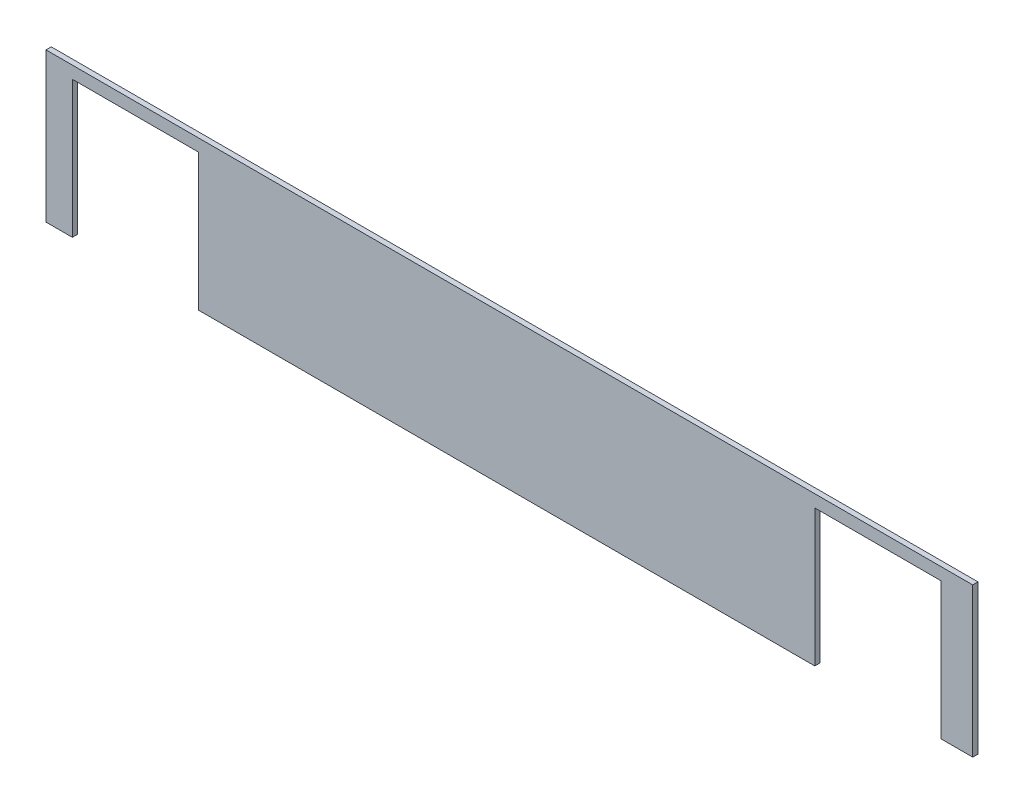
ISO-10303-21;
HEADER;
FILE_DESCRIPTION(('STEP AP214'),'2;1');
FILE_NAME('part.step','',(''),(''),'','','');
FILE_SCHEMA(('AUTOMOTIVE_DESIGN { 1 0 10303 214 1 1 1 1 }'));
ENDSEC;
DATA;
#1=APPLICATION_CONTEXT('core data for automotive mechanical design processes');
#2=APPLICATION_PROTOCOL_DEFINITION('international standard','automotive_design',2000,#1);
#3=PRODUCT_CONTEXT('',#1,'mechanical');
#4=PRODUCT('Part','Part','',(#3));
#5=PRODUCT_RELATED_PRODUCT_CATEGORY('part','',(#4));
#6=PRODUCT_DEFINITION_FORMATION('','',#4);
#7=PRODUCT_DEFINITION_CONTEXT('part definition',#1,'design');
#8=PRODUCT_DEFINITION('design','',#6,#7);
#9=PRODUCT_DEFINITION_SHAPE('','',#8);
#10=(LENGTH_UNIT() NAMED_UNIT(*) SI_UNIT(.MILLI.,.METRE.));
#11=(NAMED_UNIT(*) PLANE_ANGLE_UNIT() SI_UNIT($,.RADIAN.));
#12=(NAMED_UNIT(*) SI_UNIT($,.STERADIAN.) SOLID_ANGLE_UNIT());
#13=UNCERTAINTY_MEASURE_WITH_UNIT(LENGTH_MEASURE(1.E-05),#10,'distance_accuracy_value','');
#14=(GEOMETRIC_REPRESENTATION_CONTEXT(3) GLOBAL_UNCERTAINTY_ASSIGNED_CONTEXT((#13)) GLOBAL_UNIT_ASSIGNED_CONTEXT((#10,
#11,#12)) REPRESENTATION_CONTEXT('',''));
#15=CARTESIAN_POINT('',(0.,0.,0.));
#16=DIRECTION('',(0.,0.,1.));
#17=DIRECTION('',(1.,0.,0.));
#18=AXIS2_PLACEMENT_3D('',#15,#16,#17);
#19=CARTESIAN_POINT('',(0.,0.,76.2));
#20=DIRECTION('',(0.,1.,0.));
#21=DIRECTION('',(0.,0.,1.));
#22=AXIS2_PLACEMENT_3D('',#19,#20,#21);
#23=PLANE('',#22);
#24=DIRECTION('',(1.,0.,0.));
#25=VECTOR('',#24,1.);
#26=CARTESIAN_POINT('',(0.,0.,76.2));
#27=LINE('',#26,#25);
#28=CARTESIAN_POINT('',(12954.,0.,76.2));
#29=VERTEX_POINT('',#28);
#30=CARTESIAN_POINT('',(13411.2,0.,76.2));
#31=VERTEX_POINT('',#30);
#32=EDGE_CURVE('E139',#29,#31,#27,.T.);
#33=ORIENTED_EDGE('',*,*,#32,.F.);
#34=DIRECTION('',(0.,0.,-1.));
#35=VECTOR('',#34,1.);
#36=CARTESIAN_POINT('',(12954.,0.,76.2));
#37=LINE('',#36,#35);
#38=CARTESIAN_POINT('',(12954.,0.,0.));
#39=VERTEX_POINT('',#38);
#40=EDGE_CURVE('E125',#29,#39,#37,.T.);
#41=ORIENTED_EDGE('',*,*,#40,.T.);
#42=DIRECTION('',(1.,0.,0.));
#43=VECTOR('',#42,1.);
#44=CARTESIAN_POINT('',(0.,0.,0.));
#45=LINE('',#44,#43);
#46=CARTESIAN_POINT('',(13411.2,0.,0.));
#47=VERTEX_POINT('',#46);
#48=EDGE_CURVE('E168',#39,#47,#45,.T.);
#49=ORIENTED_EDGE('',*,*,#48,.T.);
#50=DIRECTION('',(0.,0.,-1.));
#51=VECTOR('',#50,1.);
#52=CARTESIAN_POINT('',(13411.2,0.,76.2));
#53=LINE('',#52,#51);
#54=EDGE_CURVE('E43',#31,#47,#53,.T.);
#55=ORIENTED_EDGE('',*,*,#54,.F.);
#56=EDGE_LOOP('',(#33,#41,#49,#55));
#57=FACE_BOUND('',#56,.T.);
#58=ADVANCED_FACE('F35',(#57),#23,.F.);
#59=CARTESIAN_POINT('',(0.,0.,0.));
#60=VERTEX_POINT('',#59);
#61=CARTESIAN_POINT('',(381.,0.,0.));
#62=VERTEX_POINT('',#61);
#63=EDGE_CURVE('E170',#60,#62,#45,.T.);
#64=ORIENTED_EDGE('',*,*,#63,.T.);
#65=DIRECTION('',(0.,0.,-1.));
#66=VECTOR('',#65,1.);
#67=CARTESIAN_POINT('',(381.,0.,76.2));
#68=LINE('',#67,#66);
#69=CARTESIAN_POINT('',(381.,0.,76.2));
#70=VERTEX_POINT('',#69);
#71=EDGE_CURVE('E198',#70,#62,#68,.T.);
#72=ORIENTED_EDGE('',*,*,#71,.F.);
#73=CARTESIAN_POINT('',(0.,0.,76.2));
#74=VERTEX_POINT('',#73);
#75=EDGE_CURVE('E151',#74,#70,#27,.T.);
#76=ORIENTED_EDGE('',*,*,#75,.F.);
#77=DIRECTION('',(0.,0.,-1.));
#78=VECTOR('',#77,1.);
#79=CARTESIAN_POINT('',(0.,0.,76.2));
#80=LINE('',#79,#78);
#81=EDGE_CURVE('E11',#74,#60,#80,.T.);
#82=ORIENTED_EDGE('',*,*,#81,.T.);
#83=EDGE_LOOP('',(#64,#72,#76,#82));
#84=FACE_BOUND('',#83,.T.);
#85=ADVANCED_FACE('F196',(#84),#23,.F.);
#86=CARTESIAN_POINT('',(0.,0.,76.2));
#87=DIRECTION('',(1.,0.,0.));
#88=DIRECTION('',(0.,1.,0.));
#89=AXIS2_PLACEMENT_3D('',#86,#87,#88);
#90=PLANE('',#89);
#91=DIRECTION('',(0.,-1.,0.));
#92=VECTOR('',#91,1.);
#93=CARTESIAN_POINT('',(0.,0.,0.));
#94=LINE('',#93,#92);
#95=CARTESIAN_POINT('',(-1.77635683940025E-12,2159.,0.));
#96=VERTEX_POINT('',#95);
#97=EDGE_CURVE('E165',#96,#60,#94,.T.);
#98=ORIENTED_EDGE('',*,*,#97,.T.);
#99=ORIENTED_EDGE('',*,*,#81,.F.);
#100=DIRECTION('',(0.,-1.,0.));
#101=VECTOR('',#100,1.);
#102=CARTESIAN_POINT('',(0.,0.,76.2));
#103=LINE('',#102,#101);
#104=CARTESIAN_POINT('',(-1.77635683940025E-12,2159.,76.2));
#105=VERTEX_POINT('',#104);
#106=EDGE_CURVE('E149',#105,#74,#103,.T.);
#107=ORIENTED_EDGE('',*,*,#106,.F.);
#108=DIRECTION('',(0.,0.,-1.));
#109=VECTOR('',#108,1.);
#110=CARTESIAN_POINT('',(-1.77635683940025E-12,2159.,76.2));
#111=LINE('',#110,#109);
#112=EDGE_CURVE('E162',#105,#96,#111,.T.);
#113=ORIENTED_EDGE('',*,*,#112,.T.);
#114=EDGE_LOOP('',(#98,#99,#107,#113));
#115=FACE_BOUND('',#114,.T.);
#116=ADVANCED_FACE('F37',(#115),#90,.F.);
#117=CARTESIAN_POINT('',(2209.8,-1.58313013704868E-13,0.));
#118=VERTEX_POINT('',#117);
#119=CARTESIAN_POINT('',(11125.2,0.,0.));
#120=VERTEX_POINT('',#119);
#121=EDGE_CURVE('E174',#118,#120,#45,.T.);
#122=ORIENTED_EDGE('',*,*,#121,.T.);
#123=DIRECTION('',(0.,0.,-1.));
#124=VECTOR('',#123,1.);
#125=CARTESIAN_POINT('',(11125.2,0.,76.2));
#126=LINE('',#125,#124);
#127=CARTESIAN_POINT('',(11125.2,0.,76.2));
#128=VERTEX_POINT('',#127);
#129=EDGE_CURVE('E58',#128,#120,#126,.T.);
#130=ORIENTED_EDGE('',*,*,#129,.F.);
#131=CARTESIAN_POINT('',(2209.8,-1.58313013704868E-13,76.2));
#132=VERTEX_POINT('',#131);
#133=EDGE_CURVE('E148',#132,#128,#27,.T.);
#134=ORIENTED_EDGE('',*,*,#133,.F.);
#135=DIRECTION('',(0.,0.,-1.));
#136=VECTOR('',#135,1.);
#137=CARTESIAN_POINT('',(2209.8,-1.58313013704868E-13,76.2));
#138=LINE('',#137,#136);
#139=EDGE_CURVE('E199',#132,#118,#138,.T.);
#140=ORIENTED_EDGE('',*,*,#139,.T.);
#141=EDGE_LOOP('',(#122,#130,#134,#140));
#142=FACE_BOUND('',#141,.T.);
#143=ADVANCED_FACE('F242',(#142),#23,.F.);
#144=CARTESIAN_POINT('',(13411.2,0.,76.2));
#145=DIRECTION('',(-1.,0.,0.));
#146=DIRECTION('',(0.,-1.,0.));
#147=AXIS2_PLACEMENT_3D('',#144,#145,#146);
#148=PLANE('',#147);
#149=DIRECTION('',(0.,1.,0.));
#150=VECTOR('',#149,1.);
#151=CARTESIAN_POINT('',(13411.2,0.,0.));
#152=LINE('',#151,#150);
#153=CARTESIAN_POINT('',(13411.2,2159.,0.));
#154=VERTEX_POINT('',#153);
#155=EDGE_CURVE('E173',#47,#154,#152,.T.);
#156=ORIENTED_EDGE('',*,*,#155,.T.);
#157=DIRECTION('',(0.,0.,-1.));
#158=VECTOR('',#157,1.);
#159=CARTESIAN_POINT('',(13411.2,2159.,76.2));
#160=LINE('',#159,#158);
#161=CARTESIAN_POINT('',(13411.2,2159.,76.2));
#162=VERTEX_POINT('',#161);
#163=EDGE_CURVE('E179',#162,#154,#160,.T.);
#164=ORIENTED_EDGE('',*,*,#163,.F.);
#165=DIRECTION('',(0.,1.,0.));
#166=VECTOR('',#165,1.);
#167=CARTESIAN_POINT('',(13411.2,0.,76.2));
#168=LINE('',#167,#166);
#169=EDGE_CURVE('E158',#31,#162,#168,.T.);
#170=ORIENTED_EDGE('',*,*,#169,.F.);
#171=ORIENTED_EDGE('',*,*,#54,.T.);
#172=EDGE_LOOP('',(#156,#164,#170,#171));
#173=FACE_BOUND('',#172,.T.);
#174=ADVANCED_FACE('F183',(#173),#148,.F.);
#175=CARTESIAN_POINT('',(-1.77635683940025E-12,2159.,76.2));
#176=DIRECTION('',(0.,-1.,0.));
#177=DIRECTION('',(0.,0.,-1.));
#178=AXIS2_PLACEMENT_3D('',#175,#176,#177);
#179=PLANE('',#178);
#180=DIRECTION('',(-1.,0.,0.));
#181=VECTOR('',#180,1.);
#182=CARTESIAN_POINT('',(-1.77635683940025E-12,2159.,0.));
#183=LINE('',#182,#181);
#184=EDGE_CURVE('E154',#154,#96,#183,.T.);
#185=ORIENTED_EDGE('',*,*,#184,.T.);
#186=ORIENTED_EDGE('',*,*,#112,.F.);
#187=DIRECTION('',(-1.,0.,0.));
#188=VECTOR('',#187,1.);
#189=CARTESIAN_POINT('',(-1.77635683940025E-12,2159.,76.2));
#190=LINE('',#189,#188);
#191=EDGE_CURVE('E160',#162,#105,#190,.T.);
#192=ORIENTED_EDGE('',*,*,#191,.F.);
#193=ORIENTED_EDGE('',*,*,#163,.T.);
#194=EDGE_LOOP('',(#185,#186,#192,#193));
#195=FACE_BOUND('',#194,.T.);
#196=ADVANCED_FACE('F190',(#195),#179,.F.);
#197=CARTESIAN_POINT('',(0.,0.,76.2));
#198=DIRECTION('',(0.,0.,-1.));
#199=DIRECTION('',(-1.,0.,0.));
#200=AXIS2_PLACEMENT_3D('',#197,#198,#199);
#201=PLANE('',#200);
#202=DIRECTION('',(1.,0.,0.));
#203=VECTOR('',#202,1.);
#204=CARTESIAN_POINT('',(12954.,1981.2,76.2));
#205=LINE('',#204,#203);
#206=CARTESIAN_POINT('',(11125.2,1981.2,76.2));
#207=VERTEX_POINT('',#206);
#208=CARTESIAN_POINT('',(12954.,1981.2,76.2));
#209=VERTEX_POINT('',#208);
#210=EDGE_CURVE('E135',#207,#209,#205,.T.);
#211=ORIENTED_EDGE('',*,*,#210,.T.);
#212=DIRECTION('',(0.,-1.,0.));
#213=VECTOR('',#212,1.);
#214=CARTESIAN_POINT('',(12954.,0.,76.2));
#215=LINE('',#214,#213);
#216=EDGE_CURVE('E128',#209,#29,#215,.T.);
#217=ORIENTED_EDGE('',*,*,#216,.T.);
#218=ORIENTED_EDGE('',*,*,#32,.T.);
#219=ORIENTED_EDGE('',*,*,#169,.T.);
#220=ORIENTED_EDGE('',*,*,#191,.T.);
#221=ORIENTED_EDGE('',*,*,#106,.T.);
#222=ORIENTED_EDGE('',*,*,#75,.T.);
#223=DIRECTION('',(0.,1.,0.));
#224=VECTOR('',#223,1.);
#225=CARTESIAN_POINT('',(381.,0.,76.2));
#226=LINE('',#225,#224);
#227=CARTESIAN_POINT('',(381.,1981.2,76.2));
#228=VERTEX_POINT('',#227);
#229=EDGE_CURVE('E223',#70,#228,#226,.T.);
#230=ORIENTED_EDGE('',*,*,#229,.T.);
#231=DIRECTION('',(1.,0.,0.));
#232=VECTOR('',#231,1.);
#233=CARTESIAN_POINT('',(381.,1981.2,76.2));
#234=LINE('',#233,#232);
#235=CARTESIAN_POINT('',(2209.8,1981.2,76.2));
#236=VERTEX_POINT('',#235);
#237=EDGE_CURVE('E218',#228,#236,#234,.T.);
#238=ORIENTED_EDGE('',*,*,#237,.T.);
#239=DIRECTION('',(0.,-1.,0.));
#240=VECTOR('',#239,1.);
#241=CARTESIAN_POINT('',(2209.8,-1.58313013704868E-13,76.2));
#242=LINE('',#241,#240);
#243=EDGE_CURVE('E212',#236,#132,#242,.T.);
#244=ORIENTED_EDGE('',*,*,#243,.T.);
#245=ORIENTED_EDGE('',*,*,#133,.T.);
#246=DIRECTION('',(0.,1.,0.));
#247=VECTOR('',#246,1.);
#248=CARTESIAN_POINT('',(11125.2,0.,76.2));
#249=LINE('',#248,#247);
#250=EDGE_CURVE('E143',#128,#207,#249,.T.);
#251=ORIENTED_EDGE('',*,*,#250,.T.);
#252=EDGE_LOOP('',(#211,#217,#218,#219,#220,#221,#222,#230,#238,#244,#245,#251));
#253=FACE_BOUND('',#252,.T.);
#254=ADVANCED_FACE('F138',(#253),#201,.F.);
#255=CARTESIAN_POINT('',(0.,0.,0.));
#256=DIRECTION('',(0.,0.,-1.));
#257=DIRECTION('',(-1.,0.,0.));
#258=AXIS2_PLACEMENT_3D('',#255,#256,#257);
#259=PLANE('',#258);
#260=DIRECTION('',(0.,-1.,0.));
#261=VECTOR('',#260,1.);
#262=CARTESIAN_POINT('',(12954.,0.,0.));
#263=LINE('',#262,#261);
#264=CARTESIAN_POINT('',(12954.,1981.2,0.));
#265=VERTEX_POINT('',#264);
#266=EDGE_CURVE('E131',#265,#39,#263,.T.);
#267=ORIENTED_EDGE('',*,*,#266,.F.);
#268=DIRECTION('',(1.,0.,0.));
#269=VECTOR('',#268,1.);
#270=CARTESIAN_POINT('',(12954.,1981.2,0.));
#271=LINE('',#270,#269);
#272=CARTESIAN_POINT('',(11125.2,1981.2,0.));
#273=VERTEX_POINT('',#272);
#274=EDGE_CURVE('E144',#273,#265,#271,.T.);
#275=ORIENTED_EDGE('',*,*,#274,.F.);
#276=DIRECTION('',(0.,1.,0.));
#277=VECTOR('',#276,1.);
#278=CARTESIAN_POINT('',(11125.2,0.,0.));
#279=LINE('',#278,#277);
#280=EDGE_CURVE('E201',#120,#273,#279,.T.);
#281=ORIENTED_EDGE('',*,*,#280,.F.);
#282=ORIENTED_EDGE('',*,*,#121,.F.);
#283=DIRECTION('',(0.,-1.,0.));
#284=VECTOR('',#283,1.);
#285=CARTESIAN_POINT('',(2209.8,-1.58313013704868E-13,0.));
#286=LINE('',#285,#284);
#287=CARTESIAN_POINT('',(2209.8,1981.2,0.));
#288=VERTEX_POINT('',#287);
#289=EDGE_CURVE('E207',#288,#118,#286,.T.);
#290=ORIENTED_EDGE('',*,*,#289,.F.);
#291=DIRECTION('',(1.,0.,0.));
#292=VECTOR('',#291,1.);
#293=CARTESIAN_POINT('',(381.,1981.2,0.));
#294=LINE('',#293,#292);
#295=CARTESIAN_POINT('',(381.,1981.2,0.));
#296=VERTEX_POINT('',#295);
#297=EDGE_CURVE('E227',#296,#288,#294,.T.);
#298=ORIENTED_EDGE('',*,*,#297,.F.);
#299=DIRECTION('',(0.,1.,0.));
#300=VECTOR('',#299,1.);
#301=CARTESIAN_POINT('',(381.,0.,0.));
#302=LINE('',#301,#300);
#303=EDGE_CURVE('E50',#62,#296,#302,.T.);
#304=ORIENTED_EDGE('',*,*,#303,.F.);
#305=ORIENTED_EDGE('',*,*,#63,.F.);
#306=ORIENTED_EDGE('',*,*,#97,.F.);
#307=ORIENTED_EDGE('',*,*,#184,.F.);
#308=ORIENTED_EDGE('',*,*,#155,.F.);
#309=ORIENTED_EDGE('',*,*,#48,.F.);
#310=EDGE_LOOP('',(#267,#275,#281,#282,#290,#298,#304,#305,#306,#307,#308,#309));
#311=FACE_BOUND('',#310,.T.);
#312=ADVANCED_FACE('F186',(#311),#259,.T.);
#313=CARTESIAN_POINT('',(381.,0.,76.2));
#314=DIRECTION('',(-1.,0.,0.));
#315=DIRECTION('',(0.,-1.,0.));
#316=AXIS2_PLACEMENT_3D('',#313,#314,#315);
#317=PLANE('',#316);
#318=ORIENTED_EDGE('',*,*,#303,.T.);
#319=DIRECTION('',(0.,0.,-1.));
#320=VECTOR('',#319,1.);
#321=CARTESIAN_POINT('',(381.,1981.2,76.2));
#322=LINE('',#321,#320);
#323=EDGE_CURVE('E211',#228,#296,#322,.T.);
#324=ORIENTED_EDGE('',*,*,#323,.F.);
#325=ORIENTED_EDGE('',*,*,#229,.F.);
#326=ORIENTED_EDGE('',*,*,#71,.T.);
#327=EDGE_LOOP('',(#318,#324,#325,#326));
#328=FACE_BOUND('',#327,.T.);
#329=ADVANCED_FACE('F300',(#328),#317,.F.);
#330=CARTESIAN_POINT('',(2209.8,-1.58313013704868E-13,76.2));
#331=DIRECTION('',(1.,0.,0.));
#332=DIRECTION('',(0.,0.,-1.));
#333=AXIS2_PLACEMENT_3D('',#330,#331,#332);
#334=PLANE('',#333);
#335=ORIENTED_EDGE('',*,*,#289,.T.);
#336=ORIENTED_EDGE('',*,*,#139,.F.);
#337=ORIENTED_EDGE('',*,*,#243,.F.);
#338=DIRECTION('',(0.,0.,-1.));
#339=VECTOR('',#338,1.);
#340=CARTESIAN_POINT('',(2209.8,1981.2,76.2));
#341=LINE('',#340,#339);
#342=EDGE_CURVE('E204',#236,#288,#341,.T.);
#343=ORIENTED_EDGE('',*,*,#342,.T.);
#344=EDGE_LOOP('',(#335,#336,#337,#343));
#345=FACE_BOUND('',#344,.T.);
#346=ADVANCED_FACE('F309',(#345),#334,.F.);
#347=CARTESIAN_POINT('',(381.,1981.2,76.2));
#348=DIRECTION('',(0.,1.,0.));
#349=DIRECTION('',(-1.,0.,0.));
#350=AXIS2_PLACEMENT_3D('',#347,#348,#349);
#351=PLANE('',#350);
#352=ORIENTED_EDGE('',*,*,#297,.T.);
#353=ORIENTED_EDGE('',*,*,#342,.F.);
#354=ORIENTED_EDGE('',*,*,#237,.F.);
#355=ORIENTED_EDGE('',*,*,#323,.T.);
#356=EDGE_LOOP('',(#352,#353,#354,#355));
#357=FACE_BOUND('',#356,.T.);
#358=ADVANCED_FACE('F254',(#357),#351,.F.);
#359=CARTESIAN_POINT('',(12954.,0.,76.2));
#360=DIRECTION('',(1.,0.,0.));
#361=DIRECTION('',(0.,0.,-1.));
#362=AXIS2_PLACEMENT_3D('',#359,#360,#361);
#363=PLANE('',#362);
#364=ORIENTED_EDGE('',*,*,#266,.T.);
#365=ORIENTED_EDGE('',*,*,#40,.F.);
#366=ORIENTED_EDGE('',*,*,#216,.F.);
#367=DIRECTION('',(0.,0.,-1.));
#368=VECTOR('',#367,1.);
#369=CARTESIAN_POINT('',(12954.,1981.2,76.2));
#370=LINE('',#369,#368);
#371=EDGE_CURVE('E169',#209,#265,#370,.T.);
#372=ORIENTED_EDGE('',*,*,#371,.T.);
#373=EDGE_LOOP('',(#364,#365,#366,#372));
#374=FACE_BOUND('',#373,.T.);
#375=ADVANCED_FACE('F127',(#374),#363,.F.);
#376=CARTESIAN_POINT('',(12954.,1981.2,76.2));
#377=DIRECTION('',(0.,1.,0.));
#378=DIRECTION('',(0.,0.,1.));
#379=AXIS2_PLACEMENT_3D('',#376,#377,#378);
#380=PLANE('',#379);
#381=ORIENTED_EDGE('',*,*,#274,.T.);
#382=ORIENTED_EDGE('',*,*,#371,.F.);
#383=ORIENTED_EDGE('',*,*,#210,.F.);
#384=DIRECTION('',(0.,0.,-1.));
#385=VECTOR('',#384,1.);
#386=CARTESIAN_POINT('',(11125.2,1981.2,76.2));
#387=LINE('',#386,#385);
#388=EDGE_CURVE('E232',#207,#273,#387,.T.);
#389=ORIENTED_EDGE('',*,*,#388,.T.);
#390=EDGE_LOOP('',(#381,#382,#383,#389));
#391=FACE_BOUND('',#390,.T.);
#392=ADVANCED_FACE('F246',(#391),#380,.F.);
#393=CARTESIAN_POINT('',(11125.2,0.,76.2));
#394=DIRECTION('',(-1.,0.,0.));
#395=DIRECTION('',(0.,0.,1.));
#396=AXIS2_PLACEMENT_3D('',#393,#394,#395);
#397=PLANE('',#396);
#398=ORIENTED_EDGE('',*,*,#280,.T.);
#399=ORIENTED_EDGE('',*,*,#388,.F.);
#400=ORIENTED_EDGE('',*,*,#250,.F.);
#401=ORIENTED_EDGE('',*,*,#129,.T.);
#402=EDGE_LOOP('',(#398,#399,#400,#401));
#403=FACE_BOUND('',#402,.T.);
#404=ADVANCED_FACE('F239',(#403),#397,.F.);
#405=CLOSED_SHELL('',(#58,#85,#116,#143,#174,#196,#254,#312,#329,#346,#358,#375,#392,#404));
#406=MANIFOLD_SOLID_BREP('B2',#405);
#407=ADVANCED_BREP_SHAPE_REPRESENTATION('',(#18,#406),#14);
#408=SHAPE_DEFINITION_REPRESENTATION(#9,#407);
ENDSEC;
END-ISO-10303-21;
